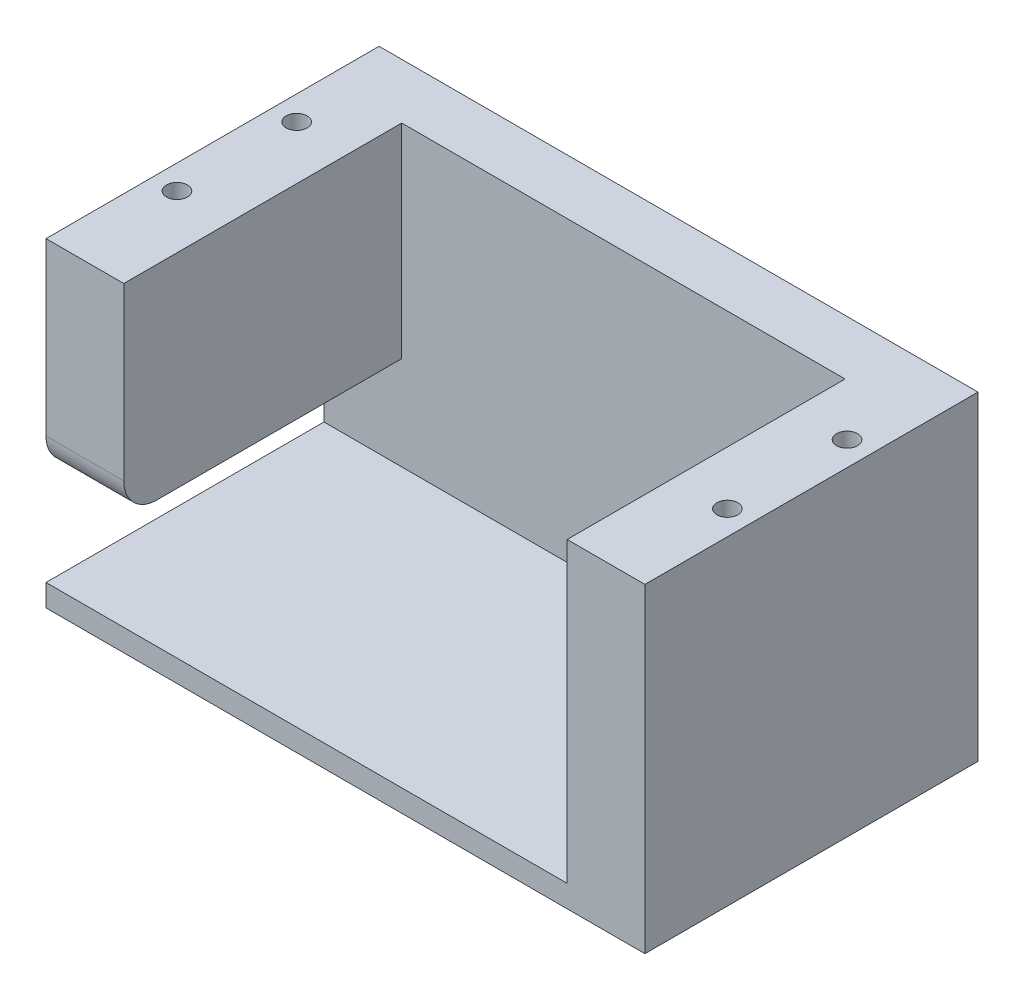
ISO-10303-21;
HEADER;
FILE_DESCRIPTION(('STEP AP214'),'2;1');
FILE_NAME('part.step','',(''),(''),'','','');
FILE_SCHEMA(('AUTOMOTIVE_DESIGN { 1 0 10303 214 1 1 1 1 }'));
ENDSEC;
DATA;
#1=APPLICATION_CONTEXT('core data for automotive mechanical design processes');
#2=APPLICATION_PROTOCOL_DEFINITION('international standard','automotive_design',2000,#1);
#3=PRODUCT_CONTEXT('',#1,'mechanical');
#4=PRODUCT('Part','Part','',(#3));
#5=PRODUCT_RELATED_PRODUCT_CATEGORY('part','',(#4));
#6=PRODUCT_DEFINITION_FORMATION('','',#4);
#7=PRODUCT_DEFINITION_CONTEXT('part definition',#1,'design');
#8=PRODUCT_DEFINITION('design','',#6,#7);
#9=PRODUCT_DEFINITION_SHAPE('','',#8);
#10=(LENGTH_UNIT() NAMED_UNIT(*) SI_UNIT(.MILLI.,.METRE.));
#11=(NAMED_UNIT(*) PLANE_ANGLE_UNIT() SI_UNIT($,.RADIAN.));
#12=(NAMED_UNIT(*) SI_UNIT($,.STERADIAN.) SOLID_ANGLE_UNIT());
#13=UNCERTAINTY_MEASURE_WITH_UNIT(LENGTH_MEASURE(1.E-05),#10,'distance_accuracy_value','');
#14=(GEOMETRIC_REPRESENTATION_CONTEXT(3) GLOBAL_UNCERTAINTY_ASSIGNED_CONTEXT((#13)) GLOBAL_UNIT_ASSIGNED_CONTEXT((#10,
#11,#12)) REPRESENTATION_CONTEXT('',''));
#15=CARTESIAN_POINT('',(0.,0.,0.));
#16=DIRECTION('',(0.,0.,1.));
#17=DIRECTION('',(1.,0.,0.));
#18=AXIS2_PLACEMENT_3D('',#15,#16,#17);
#19=CARTESIAN_POINT('',(-27.15,2.,15.1));
#20=DIRECTION('',(0.,0.,-1.));
#21=DIRECTION('',(-1.,0.,0.));
#22=AXIS2_PLACEMENT_3D('',#19,#20,#21);
#23=PLANE('',#22);
#24=DIRECTION('',(1.,0.,0.));
#25=VECTOR('',#24,1.);
#26=CARTESIAN_POINT('',(-22.15,13.5,15.1));
#27=LINE('',#26,#25);
#28=CARTESIAN_POINT('',(-27.15,13.5,15.1));
#29=VERTEX_POINT('',#28);
#30=CARTESIAN_POINT('',(-20.1,13.5,15.1));
#31=VERTEX_POINT('',#30);
#32=EDGE_CURVE('E177',#29,#31,#27,.T.);
#33=ORIENTED_EDGE('',*,*,#32,.T.);
#34=DIRECTION('',(0.,1.,0.));
#35=VECTOR('',#34,1.);
#36=CARTESIAN_POINT('',(-20.1,-38.5097519123482,15.1));
#37=LINE('',#36,#35);
#38=CARTESIAN_POINT('',(-20.1,29.,15.1));
#39=VERTEX_POINT('',#38);
#40=EDGE_CURVE('E181',#31,#39,#37,.T.);
#41=ORIENTED_EDGE('',*,*,#40,.T.);
#42=DIRECTION('',(1.,0.,0.));
#43=VECTOR('',#42,1.);
#44=CARTESIAN_POINT('',(0.,29.,15.1));
#45=LINE('',#44,#43);
#46=CARTESIAN_POINT('',(-27.15,29.,15.1));
#47=VERTEX_POINT('',#46);
#48=EDGE_CURVE('E209',#47,#39,#45,.T.);
#49=ORIENTED_EDGE('',*,*,#48,.F.);
#50=DIRECTION('',(0.,-1.,0.));
#51=VECTOR('',#50,1.);
#52=CARTESIAN_POINT('',(-27.15,2.,15.1));
#53=LINE('',#52,#51);
#54=EDGE_CURVE('E175',#47,#29,#53,.T.);
#55=ORIENTED_EDGE('',*,*,#54,.T.);
#56=EDGE_LOOP('',(#33,#41,#49,#55));
#57=FACE_BOUND('',#56,.T.);
#58=ADVANCED_FACE('F43',(#57),#23,.F.);
#59=DIRECTION('',(-1.,0.,0.));
#60=VECTOR('',#59,1.);
#61=CARTESIAN_POINT('',(-20.1,2.,15.1));
#62=LINE('',#61,#60);
#63=CARTESIAN_POINT('',(20.1,2.,15.1));
#64=VERTEX_POINT('',#63);
#65=CARTESIAN_POINT('',(-27.15,2.,15.1));
#66=VERTEX_POINT('',#65);
#67=EDGE_CURVE('E187',#64,#66,#62,.T.);
#68=ORIENTED_EDGE('',*,*,#67,.T.);
#69=CARTESIAN_POINT('',(-27.15,0.,15.1));
#70=VERTEX_POINT('',#69);
#71=EDGE_CURVE('E174',#66,#70,#53,.T.);
#72=ORIENTED_EDGE('',*,*,#71,.T.);
#73=DIRECTION('',(1.,0.,0.));
#74=VECTOR('',#73,1.);
#75=CARTESIAN_POINT('',(-27.15,0.,15.1));
#76=LINE('',#75,#74);
#77=CARTESIAN_POINT('',(27.15,0.,15.1));
#78=VERTEX_POINT('',#77);
#79=EDGE_CURVE('E148',#70,#78,#76,.T.);
#80=ORIENTED_EDGE('',*,*,#79,.T.);
#81=DIRECTION('',(0.,-1.,0.));
#82=VECTOR('',#81,1.);
#83=CARTESIAN_POINT('',(27.15,2.,15.1));
#84=LINE('',#83,#82);
#85=CARTESIAN_POINT('',(27.15,29.,15.1));
#86=VERTEX_POINT('',#85);
#87=EDGE_CURVE('E171',#86,#78,#84,.T.);
#88=ORIENTED_EDGE('',*,*,#87,.F.);
#89=CARTESIAN_POINT('',(20.1,29.,15.1));
#90=VERTEX_POINT('',#89);
#91=EDGE_CURVE('E208',#90,#86,#45,.T.);
#92=ORIENTED_EDGE('',*,*,#91,.F.);
#93=DIRECTION('',(0.,1.,0.));
#94=VECTOR('',#93,1.);
#95=CARTESIAN_POINT('',(20.1,-38.5097519123482,15.1));
#96=LINE('',#95,#94);
#97=EDGE_CURVE('E188',#64,#90,#96,.T.);
#98=ORIENTED_EDGE('',*,*,#97,.F.);
#99=EDGE_LOOP('',(#68,#72,#80,#88,#92,#98));
#100=FACE_BOUND('',#99,.T.);
#101=ADVANCED_FACE('F237',(#100),#23,.F.);
#102=CARTESIAN_POINT('',(0.,29.,0.));
#103=DIRECTION('',(0.,1.,0.));
#104=DIRECTION('',(0.,0.,1.));
#105=AXIS2_PLACEMENT_3D('',#102,#103,#104);
#106=PLANE('',#105);
#107=CARTESIAN_POINT('',(-24.95,29.,-5.42499999999999));
#108=DIRECTION('',(0.,1.,0.));
#109=DIRECTION('',(0.,0.,-1.));
#110=AXIS2_PLACEMENT_3D('',#107,#108,#109);
#111=CIRCLE('',#110,0.950000000000004);
#112=CARTESIAN_POINT('',(-24.95,29.,-6.375));
#113=VERTEX_POINT('',#112);
#114=EDGE_CURVE('E469',#113,#113,#111,.T.);
#115=ORIENTED_EDGE('',*,*,#114,.F.);
#116=EDGE_LOOP('',(#115));
#117=FACE_BOUND('',#116,.T.);
#118=CARTESIAN_POINT('',(24.95,29.,5.42500000000001));
#119=DIRECTION('',(0.,1.,0.));
#120=DIRECTION('',(0.,0.,-1.));
#121=AXIS2_PLACEMENT_3D('',#118,#119,#120);
#122=CIRCLE('',#121,0.950000000000001);
#123=CARTESIAN_POINT('',(24.95,29.,4.475));
#124=VERTEX_POINT('',#123);
#125=EDGE_CURVE('E470',#124,#124,#122,.T.);
#126=ORIENTED_EDGE('',*,*,#125,.F.);
#127=EDGE_LOOP('',(#126));
#128=FACE_BOUND('',#127,.T.);
#129=CARTESIAN_POINT('',(24.95,29.,-5.42499999999999));
#130=DIRECTION('',(0.,1.,0.));
#131=DIRECTION('',(0.,0.,1.));
#132=AXIS2_PLACEMENT_3D('',#129,#130,#131);
#133=CIRCLE('',#132,0.950000000000004);
#134=CARTESIAN_POINT('',(24.95,29.,-4.47499999999999));
#135=VERTEX_POINT('',#134);
#136=EDGE_CURVE('E482',#135,#135,#133,.T.);
#137=ORIENTED_EDGE('',*,*,#136,.F.);
#138=EDGE_LOOP('',(#137));
#139=FACE_BOUND('',#138,.T.);
#140=CARTESIAN_POINT('',(-24.95,29.,5.42500000000001));
#141=DIRECTION('',(0.,1.,0.));
#142=DIRECTION('',(0.,0.,1.));
#143=AXIS2_PLACEMENT_3D('',#140,#141,#142);
#144=CIRCLE('',#143,0.950000000000001);
#145=CARTESIAN_POINT('',(-24.95,29.,6.37500000000001));
#146=VERTEX_POINT('',#145);
#147=EDGE_CURVE('E473',#146,#146,#144,.T.);
#148=ORIENTED_EDGE('',*,*,#147,.F.);
#149=EDGE_LOOP('',(#148));
#150=FACE_BOUND('',#149,.T.);
#151=DIRECTION('',(0.,0.,-1.));
#152=VECTOR('',#151,1.);
#153=CARTESIAN_POINT('',(20.1,29.,0.));
#154=LINE('',#153,#152);
#155=CARTESIAN_POINT('',(20.1,29.,-10.1));
#156=VERTEX_POINT('',#155);
#157=EDGE_CURVE('E196',#90,#156,#154,.T.);
#158=ORIENTED_EDGE('',*,*,#157,.F.);
#159=ORIENTED_EDGE('',*,*,#91,.T.);
#160=DIRECTION('',(0.,0.,-1.));
#161=VECTOR('',#160,1.);
#162=CARTESIAN_POINT('',(27.15,29.,0.));
#163=LINE('',#162,#161);
#164=CARTESIAN_POINT('',(27.15,29.,-15.1));
#165=VERTEX_POINT('',#164);
#166=EDGE_CURVE('E154',#86,#165,#163,.T.);
#167=ORIENTED_EDGE('',*,*,#166,.T.);
#168=DIRECTION('',(-1.,0.,0.));
#169=VECTOR('',#168,1.);
#170=CARTESIAN_POINT('',(0.,29.,-15.1));
#171=LINE('',#170,#169);
#172=CARTESIAN_POINT('',(-27.15,29.,-15.1));
#173=VERTEX_POINT('',#172);
#174=EDGE_CURVE('E202',#165,#173,#171,.T.);
#175=ORIENTED_EDGE('',*,*,#174,.T.);
#176=DIRECTION('',(0.,0.,1.));
#177=VECTOR('',#176,1.);
#178=CARTESIAN_POINT('',(-27.15,29.,0.));
#179=LINE('',#178,#177);
#180=EDGE_CURVE('E205',#173,#47,#179,.T.);
#181=ORIENTED_EDGE('',*,*,#180,.T.);
#182=ORIENTED_EDGE('',*,*,#48,.T.);
#183=DIRECTION('',(0.,0.,-1.));
#184=VECTOR('',#183,1.);
#185=CARTESIAN_POINT('',(-20.1,29.,0.));
#186=LINE('',#185,#184);
#187=CARTESIAN_POINT('',(-20.1,29.,-10.1));
#188=VERTEX_POINT('',#187);
#189=EDGE_CURVE('E185',#39,#188,#186,.T.);
#190=ORIENTED_EDGE('',*,*,#189,.T.);
#191=DIRECTION('',(1.,0.,0.));
#192=VECTOR('',#191,1.);
#193=CARTESIAN_POINT('',(0.,29.,-10.1));
#194=LINE('',#193,#192);
#195=EDGE_CURVE('E147',#188,#156,#194,.T.);
#196=ORIENTED_EDGE('',*,*,#195,.T.);
#197=EDGE_LOOP('',(#158,#159,#167,#175,#181,#182,#190,#196));
#198=FACE_BOUND('',#197,.T.);
#199=ADVANCED_FACE('F224',(#117,#128,#139,#150,#198),#106,.T.);
#200=CARTESIAN_POINT('',(27.15,2.,-10.1));
#201=DIRECTION('',(-1.,0.,0.));
#202=DIRECTION('',(0.,0.,1.));
#203=AXIS2_PLACEMENT_3D('',#200,#201,#202);
#204=PLANE('',#203);
#205=DIRECTION('',(0.,0.,-1.));
#206=VECTOR('',#205,1.);
#207=CARTESIAN_POINT('',(27.15,0.,-10.1));
#208=LINE('',#207,#206);
#209=CARTESIAN_POINT('',(27.15,0.,-15.1));
#210=VERTEX_POINT('',#209);
#211=EDGE_CURVE('E152',#78,#210,#208,.T.);
#212=ORIENTED_EDGE('',*,*,#211,.T.);
#213=DIRECTION('',(0.,-1.,0.));
#214=VECTOR('',#213,1.);
#215=CARTESIAN_POINT('',(27.15,2.,-15.1));
#216=LINE('',#215,#214);
#217=EDGE_CURVE('E168',#165,#210,#216,.T.);
#218=ORIENTED_EDGE('',*,*,#217,.F.);
#219=ORIENTED_EDGE('',*,*,#166,.F.);
#220=ORIENTED_EDGE('',*,*,#87,.T.);
#221=EDGE_LOOP('',(#212,#218,#219,#220));
#222=FACE_BOUND('',#221,.T.);
#223=ADVANCED_FACE('F240',(#222),#204,.F.);
#224=CARTESIAN_POINT('',(-27.15,2.,-15.1));
#225=DIRECTION('',(0.,0.,1.));
#226=DIRECTION('',(1.,0.,0.));
#227=AXIS2_PLACEMENT_3D('',#224,#225,#226);
#228=PLANE('',#227);
#229=DIRECTION('',(-1.,0.,0.));
#230=VECTOR('',#229,1.);
#231=CARTESIAN_POINT('',(-27.15,0.,-15.1));
#232=LINE('',#231,#230);
#233=CARTESIAN_POINT('',(-27.15,0.,-15.1));
#234=VERTEX_POINT('',#233);
#235=EDGE_CURVE('E159',#210,#234,#232,.T.);
#236=ORIENTED_EDGE('',*,*,#235,.T.);
#237=DIRECTION('',(0.,-1.,0.));
#238=VECTOR('',#237,1.);
#239=CARTESIAN_POINT('',(-27.15,2.,-15.1));
#240=LINE('',#239,#238);
#241=EDGE_CURVE('E165',#173,#234,#240,.T.);
#242=ORIENTED_EDGE('',*,*,#241,.F.);
#243=ORIENTED_EDGE('',*,*,#174,.F.);
#244=ORIENTED_EDGE('',*,*,#217,.T.);
#245=EDGE_LOOP('',(#236,#242,#243,#244));
#246=FACE_BOUND('',#245,.T.);
#247=ADVANCED_FACE('F232',(#246),#228,.F.);
#248=CARTESIAN_POINT('',(-27.15,2.,-10.1));
#249=DIRECTION('',(1.,0.,0.));
#250=DIRECTION('',(0.,0.,-1.));
#251=AXIS2_PLACEMENT_3D('',#248,#249,#250);
#252=PLANE('',#251);
#253=DIRECTION('',(0.,0.,1.));
#254=VECTOR('',#253,1.);
#255=CARTESIAN_POINT('',(-27.15,10.5,15.1));
#256=LINE('',#255,#254);
#257=CARTESIAN_POINT('',(-27.15,10.5,-10.1));
#258=VERTEX_POINT('',#257);
#259=CARTESIAN_POINT('',(-27.15,10.5,12.1));
#260=VERTEX_POINT('',#259);
#261=EDGE_CURVE('E126',#258,#260,#256,.T.);
#262=ORIENTED_EDGE('',*,*,#261,.T.);
#263=CARTESIAN_POINT('',(-27.15,13.5,12.1));
#264=DIRECTION('',(1.,0.,0.));
#265=DIRECTION('',(0.,0.,-1.));
#266=AXIS2_PLACEMENT_3D('',#263,#264,#265);
#267=CIRCLE('',#266,3.);
#268=EDGE_CURVE('E11',#260,#29,#267,.F.);
#269=ORIENTED_EDGE('',*,*,#268,.T.);
#270=ORIENTED_EDGE('',*,*,#54,.F.);
#271=ORIENTED_EDGE('',*,*,#180,.F.);
#272=ORIENTED_EDGE('',*,*,#241,.T.);
#273=DIRECTION('',(0.,0.,1.));
#274=VECTOR('',#273,1.);
#275=CARTESIAN_POINT('',(-27.15,0.,-10.1));
#276=LINE('',#275,#274);
#277=EDGE_CURVE('E162',#234,#70,#276,.T.);
#278=ORIENTED_EDGE('',*,*,#277,.T.);
#279=ORIENTED_EDGE('',*,*,#71,.F.);
#280=DIRECTION('',(0.,0.,1.));
#281=VECTOR('',#280,1.);
#282=CARTESIAN_POINT('',(-27.15,2.,15.1));
#283=LINE('',#282,#281);
#284=CARTESIAN_POINT('',(-27.15,2.,-10.1));
#285=VERTEX_POINT('',#284);
#286=EDGE_CURVE('E132',#285,#66,#283,.T.);
#287=ORIENTED_EDGE('',*,*,#286,.F.);
#288=DIRECTION('',(0.,1.,0.));
#289=VECTOR('',#288,1.);
#290=CARTESIAN_POINT('',(-27.15,10.5,-10.1));
#291=LINE('',#290,#289);
#292=EDGE_CURVE('E131',#285,#258,#291,.T.);
#293=ORIENTED_EDGE('',*,*,#292,.T.);
#294=EDGE_LOOP('',(#262,#269,#270,#271,#272,#278,#279,#287,#293));
#295=FACE_BOUND('',#294,.T.);
#296=ADVANCED_FACE('F228',(#295),#252,.F.);
#297=CARTESIAN_POINT('',(0.,0.,0.));
#298=DIRECTION('',(0.,1.,0.));
#299=DIRECTION('',(0.,0.,1.));
#300=AXIS2_PLACEMENT_3D('',#297,#298,#299);
#301=PLANE('',#300);
#302=ORIENTED_EDGE('',*,*,#79,.F.);
#303=ORIENTED_EDGE('',*,*,#277,.F.);
#304=ORIENTED_EDGE('',*,*,#235,.F.);
#305=ORIENTED_EDGE('',*,*,#211,.F.);
#306=EDGE_LOOP('',(#302,#303,#304,#305));
#307=FACE_BOUND('',#306,.T.);
#308=ADVANCED_FACE('F235',(#307),#301,.F.);
#309=CARTESIAN_POINT('',(20.1,29.,0.));
#310=DIRECTION('',(-1.,0.,0.));
#311=DIRECTION('',(0.,0.,1.));
#312=AXIS2_PLACEMENT_3D('',#309,#310,#311);
#313=PLANE('',#312);
#314=DIRECTION('',(0.,0.,-1.));
#315=VECTOR('',#314,1.);
#316=CARTESIAN_POINT('',(20.1,2.,0.));
#317=LINE('',#316,#315);
#318=CARTESIAN_POINT('',(20.1,2.,-10.1));
#319=VERTEX_POINT('',#318);
#320=EDGE_CURVE('E190',#64,#319,#317,.T.);
#321=ORIENTED_EDGE('',*,*,#320,.F.);
#322=ORIENTED_EDGE('',*,*,#97,.T.);
#323=ORIENTED_EDGE('',*,*,#157,.T.);
#324=DIRECTION('',(0.,-1.,0.));
#325=VECTOR('',#324,1.);
#326=CARTESIAN_POINT('',(20.1,29.,-10.1));
#327=LINE('',#326,#325);
#328=EDGE_CURVE('E149',#156,#319,#327,.T.);
#329=ORIENTED_EDGE('',*,*,#328,.T.);
#330=EDGE_LOOP('',(#321,#322,#323,#329));
#331=FACE_BOUND('',#330,.T.);
#332=ADVANCED_FACE('F221',(#331),#313,.T.);
#333=CARTESIAN_POINT('',(-20.1,29.,0.));
#334=DIRECTION('',(-1.,0.,0.));
#335=DIRECTION('',(0.,0.,1.));
#336=AXIS2_PLACEMENT_3D('',#333,#334,#335);
#337=PLANE('',#336);
#338=ORIENTED_EDGE('',*,*,#40,.F.);
#339=CARTESIAN_POINT('',(-20.1,13.5,12.1));
#340=DIRECTION('',(-1.,0.,0.));
#341=DIRECTION('',(0.,0.,-1.));
#342=AXIS2_PLACEMENT_3D('',#339,#340,#341);
#343=CIRCLE('',#342,3.);
#344=CARTESIAN_POINT('',(-20.1,10.5,12.1));
#345=VERTEX_POINT('',#344);
#346=EDGE_CURVE('E142',#345,#31,#343,.T.);
#347=ORIENTED_EDGE('',*,*,#346,.F.);
#348=DIRECTION('',(0.,0.,1.));
#349=VECTOR('',#348,1.);
#350=CARTESIAN_POINT('',(-20.1,10.5,-10.1));
#351=LINE('',#350,#349);
#352=CARTESIAN_POINT('',(-20.1,10.5,-10.1));
#353=VERTEX_POINT('',#352);
#354=EDGE_CURVE('E124',#353,#345,#351,.T.);
#355=ORIENTED_EDGE('',*,*,#354,.F.);
#356=DIRECTION('',(0.,-1.,0.));
#357=VECTOR('',#356,1.);
#358=CARTESIAN_POINT('',(-20.1,29.,-10.1));
#359=LINE('',#358,#357);
#360=EDGE_CURVE('E139',#188,#353,#359,.T.);
#361=ORIENTED_EDGE('',*,*,#360,.F.);
#362=ORIENTED_EDGE('',*,*,#189,.F.);
#363=EDGE_LOOP('',(#338,#347,#355,#361,#362));
#364=FACE_BOUND('',#363,.T.);
#365=ADVANCED_FACE('F137',(#364),#337,.F.);
#366=CARTESIAN_POINT('',(0.,29.,-10.1));
#367=DIRECTION('',(0.,0.,-1.));
#368=DIRECTION('',(-1.,0.,0.));
#369=AXIS2_PLACEMENT_3D('',#366,#367,#368);
#370=PLANE('',#369);
#371=DIRECTION('',(1.,0.,0.));
#372=VECTOR('',#371,1.);
#373=CARTESIAN_POINT('',(0.,2.,-10.1));
#374=LINE('',#373,#372);
#375=EDGE_CURVE('E199',#285,#319,#374,.T.);
#376=ORIENTED_EDGE('',*,*,#375,.T.);
#377=ORIENTED_EDGE('',*,*,#328,.F.);
#378=ORIENTED_EDGE('',*,*,#195,.F.);
#379=ORIENTED_EDGE('',*,*,#360,.T.);
#380=DIRECTION('',(1.,0.,0.));
#381=VECTOR('',#380,1.);
#382=CARTESIAN_POINT('',(-27.151,10.5,-10.1));
#383=LINE('',#382,#381);
#384=EDGE_CURVE('E121',#258,#353,#383,.T.);
#385=ORIENTED_EDGE('',*,*,#384,.F.);
#386=ORIENTED_EDGE('',*,*,#292,.F.);
#387=EDGE_LOOP('',(#376,#377,#378,#379,#385,#386));
#388=FACE_BOUND('',#387,.T.);
#389=ADVANCED_FACE('F145',(#388),#370,.F.);
#390=CARTESIAN_POINT('',(0.,2.,0.));
#391=DIRECTION('',(0.,1.,0.));
#392=DIRECTION('',(0.,0.,1.));
#393=AXIS2_PLACEMENT_3D('',#390,#391,#392);
#394=PLANE('',#393);
#395=ORIENTED_EDGE('',*,*,#320,.T.);
#396=ORIENTED_EDGE('',*,*,#375,.F.);
#397=ORIENTED_EDGE('',*,*,#286,.T.);
#398=ORIENTED_EDGE('',*,*,#67,.F.);
#399=EDGE_LOOP('',(#395,#396,#397,#398));
#400=FACE_BOUND('',#399,.T.);
#401=ADVANCED_FACE('F218',(#400),#394,.T.);
#402=CARTESIAN_POINT('',(-27.151,10.5,15.1));
#403=DIRECTION('',(0.,-1.,0.));
#404=DIRECTION('',(0.,0.,-1.));
#405=AXIS2_PLACEMENT_3D('',#402,#403,#404);
#406=PLANE('',#405);
#407=ORIENTED_EDGE('',*,*,#384,.T.);
#408=ORIENTED_EDGE('',*,*,#354,.T.);
#409=DIRECTION('',(1.,0.,0.));
#410=VECTOR('',#409,1.);
#411=CARTESIAN_POINT('',(-27.15,10.5,12.1));
#412=LINE('',#411,#410);
#413=EDGE_CURVE('E51',#345,#260,#412,.F.);
#414=ORIENTED_EDGE('',*,*,#413,.T.);
#415=ORIENTED_EDGE('',*,*,#261,.F.);
#416=EDGE_LOOP('',(#407,#408,#414,#415));
#417=FACE_BOUND('',#416,.T.);
#418=ADVANCED_FACE('F123',(#417),#406,.T.);
#419=CARTESIAN_POINT('',(-24.95,19.,5.42500000000001));
#420=DIRECTION('',(0.,1.,0.));
#421=DIRECTION('',(0.,0.,1.));
#422=AXIS2_PLACEMENT_3D('',#419,#420,#421);
#423=CYLINDRICAL_SURFACE('',#422,0.950000000000001);
#424=CARTESIAN_POINT('',(-24.95,19.,5.42500000000001));
#425=DIRECTION('',(0.,1.,0.));
#426=DIRECTION('',(0.,0.,1.));
#427=AXIS2_PLACEMENT_3D('',#424,#425,#426);
#428=CIRCLE('',#427,0.950000000000001);
#429=CARTESIAN_POINT('',(-24.95,19.,6.37500000000001));
#430=VERTEX_POINT('',#429);
#431=EDGE_CURVE('E483',#430,#430,#428,.T.);
#432=ORIENTED_EDGE('',*,*,#431,.F.);
#433=EDGE_LOOP('',(#432));
#434=FACE_BOUND('',#433,.T.);
#435=ORIENTED_EDGE('',*,*,#147,.T.);
#436=EDGE_LOOP('',(#435));
#437=FACE_BOUND('',#436,.T.);
#438=ADVANCED_FACE('F289',(#434,#437),#423,.F.);
#439=CARTESIAN_POINT('',(-24.95,19.,5.42500000000001));
#440=DIRECTION('',(0.,1.,0.));
#441=DIRECTION('',(0.,0.,1.));
#442=AXIS2_PLACEMENT_3D('',#439,#440,#441);
#443=PLANE('',#442);
#444=ORIENTED_EDGE('',*,*,#431,.T.);
#445=EDGE_LOOP('',(#444));
#446=FACE_BOUND('',#445,.T.);
#447=ADVANCED_FACE('F358',(#446),#443,.T.);
#448=CARTESIAN_POINT('',(24.95,19.,-5.42499999999999));
#449=DIRECTION('',(0.,1.,0.));
#450=DIRECTION('',(0.,0.,1.));
#451=AXIS2_PLACEMENT_3D('',#448,#449,#450);
#452=CYLINDRICAL_SURFACE('',#451,0.950000000000004);
#453=CARTESIAN_POINT('',(24.95,19.,-5.42499999999999));
#454=DIRECTION('',(0.,1.,0.));
#455=DIRECTION('',(0.,0.,1.));
#456=AXIS2_PLACEMENT_3D('',#453,#454,#455);
#457=CIRCLE('',#456,0.950000000000004);
#458=CARTESIAN_POINT('',(24.95,19.,-4.47499999999999));
#459=VERTEX_POINT('',#458);
#460=EDGE_CURVE('E183',#459,#459,#457,.T.);
#461=ORIENTED_EDGE('',*,*,#460,.F.);
#462=EDGE_LOOP('',(#461));
#463=FACE_BOUND('',#462,.T.);
#464=ORIENTED_EDGE('',*,*,#136,.T.);
#465=EDGE_LOOP('',(#464));
#466=FACE_BOUND('',#465,.T.);
#467=ADVANCED_FACE('F367',(#463,#466),#452,.F.);
#468=CARTESIAN_POINT('',(24.95,19.,-5.42499999999999));
#469=DIRECTION('',(0.,1.,0.));
#470=DIRECTION('',(0.,0.,1.));
#471=AXIS2_PLACEMENT_3D('',#468,#469,#470);
#472=PLANE('',#471);
#473=ORIENTED_EDGE('',*,*,#460,.T.);
#474=EDGE_LOOP('',(#473));
#475=FACE_BOUND('',#474,.T.);
#476=ADVANCED_FACE('F376',(#475),#472,.T.);
#477=CARTESIAN_POINT('',(24.95,19.,5.42500000000001));
#478=DIRECTION('',(0.,1.,0.));
#479=DIRECTION('',(0.,0.,1.));
#480=AXIS2_PLACEMENT_3D('',#477,#478,#479);
#481=CYLINDRICAL_SURFACE('',#480,0.950000000000001);
#482=CARTESIAN_POINT('',(24.95,19.,5.42500000000001));
#483=DIRECTION('',(0.,1.,0.));
#484=DIRECTION('',(0.,0.,-1.));
#485=AXIS2_PLACEMENT_3D('',#482,#483,#484);
#486=CIRCLE('',#485,0.950000000000001);
#487=CARTESIAN_POINT('',(24.95,19.,4.475));
#488=VERTEX_POINT('',#487);
#489=EDGE_CURVE('E476',#488,#488,#486,.T.);
#490=ORIENTED_EDGE('',*,*,#489,.F.);
#491=EDGE_LOOP('',(#490));
#492=FACE_BOUND('',#491,.T.);
#493=ORIENTED_EDGE('',*,*,#125,.T.);
#494=EDGE_LOOP('',(#493));
#495=FACE_BOUND('',#494,.T.);
#496=ADVANCED_FACE('F385',(#492,#495),#481,.F.);
#497=CARTESIAN_POINT('',(24.95,19.,5.42500000000001));
#498=DIRECTION('',(0.,-1.,0.));
#499=DIRECTION('',(0.,0.,-1.));
#500=AXIS2_PLACEMENT_3D('',#497,#498,#499);
#501=PLANE('',#500);
#502=ORIENTED_EDGE('',*,*,#489,.T.);
#503=EDGE_LOOP('',(#502));
#504=FACE_BOUND('',#503,.T.);
#505=ADVANCED_FACE('F394',(#504),#501,.F.);
#506=CARTESIAN_POINT('',(-24.95,19.,-5.42499999999999));
#507=DIRECTION('',(0.,1.,0.));
#508=DIRECTION('',(0.,0.,1.));
#509=AXIS2_PLACEMENT_3D('',#506,#507,#508);
#510=CYLINDRICAL_SURFACE('',#509,0.950000000000004);
#511=CARTESIAN_POINT('',(-24.95,19.,-5.42499999999999));
#512=DIRECTION('',(0.,1.,0.));
#513=DIRECTION('',(0.,0.,-1.));
#514=AXIS2_PLACEMENT_3D('',#511,#512,#513);
#515=CIRCLE('',#514,0.950000000000004);
#516=CARTESIAN_POINT('',(-24.95,19.,-6.375));
#517=VERTEX_POINT('',#516);
#518=EDGE_CURVE('E468',#517,#517,#515,.T.);
#519=ORIENTED_EDGE('',*,*,#518,.F.);
#520=EDGE_LOOP('',(#519));
#521=FACE_BOUND('',#520,.T.);
#522=ORIENTED_EDGE('',*,*,#114,.T.);
#523=EDGE_LOOP('',(#522));
#524=FACE_BOUND('',#523,.T.);
#525=ADVANCED_FACE('F403',(#521,#524),#510,.F.);
#526=CARTESIAN_POINT('',(-24.95,19.,-5.42499999999999));
#527=DIRECTION('',(0.,-1.,0.));
#528=DIRECTION('',(0.,0.,-1.));
#529=AXIS2_PLACEMENT_3D('',#526,#527,#528);
#530=PLANE('',#529);
#531=ORIENTED_EDGE('',*,*,#518,.T.);
#532=EDGE_LOOP('',(#531));
#533=FACE_BOUND('',#532,.T.);
#534=ADVANCED_FACE('F296',(#533),#530,.F.);
#535=CARTESIAN_POINT('',(-27.15,13.5,12.1));
#536=DIRECTION('',(-1.,0.,0.));
#537=DIRECTION('',(0.,0.,1.));
#538=AXIS2_PLACEMENT_3D('',#535,#536,#537);
#539=CYLINDRICAL_SURFACE('',#538,3.);
#540=ORIENTED_EDGE('',*,*,#268,.F.);
#541=ORIENTED_EDGE('',*,*,#413,.F.);
#542=ORIENTED_EDGE('',*,*,#346,.T.);
#543=ORIENTED_EDGE('',*,*,#32,.F.);
#544=EDGE_LOOP('',(#540,#541,#542,#543));
#545=FACE_BOUND('',#544,.T.);
#546=ADVANCED_FACE('F45',(#545),#539,.T.);
#547=CLOSED_SHELL('',(#58,#101,#199,#223,#247,#296,#308,#332,#365,#389,#401,#418,#438,#447,#467,
#476,#496,#505,#525,#534,#546));
#548=MANIFOLD_SOLID_BREP('B2',#547);
#549=ADVANCED_BREP_SHAPE_REPRESENTATION('',(#18,#548),#14);
#550=SHAPE_DEFINITION_REPRESENTATION(#9,#549);
ENDSEC;
END-ISO-10303-21;
